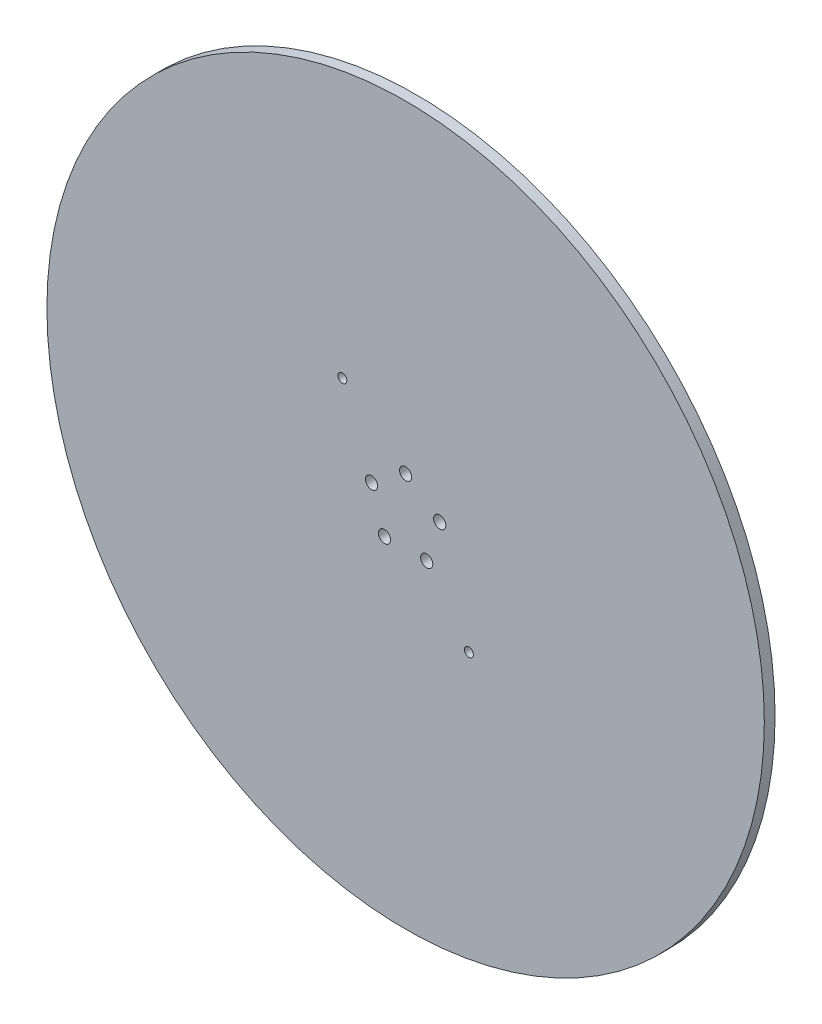
ISO-10303-21;
HEADER;
FILE_DESCRIPTION(('STEP AP214'),'2;1');
FILE_NAME('part.step','',(''),(''),'','','');
FILE_SCHEMA(('AUTOMOTIVE_DESIGN { 1 0 10303 214 1 1 1 1 }'));
ENDSEC;
DATA;
#1=APPLICATION_CONTEXT('core data for automotive mechanical design processes');
#2=APPLICATION_PROTOCOL_DEFINITION('international standard','automotive_design',2000,#1);
#3=PRODUCT_CONTEXT('',#1,'mechanical');
#4=PRODUCT('Part','Part','',(#3));
#5=PRODUCT_RELATED_PRODUCT_CATEGORY('part','',(#4));
#6=PRODUCT_DEFINITION_FORMATION('','',#4);
#7=PRODUCT_DEFINITION_CONTEXT('part definition',#1,'design');
#8=PRODUCT_DEFINITION('design','',#6,#7);
#9=PRODUCT_DEFINITION_SHAPE('','',#8);
#10=(LENGTH_UNIT() NAMED_UNIT(*) SI_UNIT(.MILLI.,.METRE.));
#11=(NAMED_UNIT(*) PLANE_ANGLE_UNIT() SI_UNIT($,.RADIAN.));
#12=(NAMED_UNIT(*) SI_UNIT($,.STERADIAN.) SOLID_ANGLE_UNIT());
#13=UNCERTAINTY_MEASURE_WITH_UNIT(LENGTH_MEASURE(1.E-05),#10,'distance_accuracy_value','');
#14=(GEOMETRIC_REPRESENTATION_CONTEXT(3) GLOBAL_UNCERTAINTY_ASSIGNED_CONTEXT((#13)) GLOBAL_UNIT_ASSIGNED_CONTEXT((#10,
#11,#12)) REPRESENTATION_CONTEXT('',''));
#15=CARTESIAN_POINT('',(0.,0.,0.));
#16=DIRECTION('',(0.,0.,1.));
#17=DIRECTION('',(1.,0.,0.));
#18=AXIS2_PLACEMENT_3D('',#15,#16,#17);
#19=CARTESIAN_POINT('',(0.,0.,3.));
#20=DIRECTION('',(0.,0.,-1.));
#21=DIRECTION('',(-1.,0.,0.));
#22=AXIS2_PLACEMENT_3D('',#19,#20,#21);
#23=CYLINDRICAL_SURFACE('',#22,100.);
#24=CARTESIAN_POINT('',(0.,0.,3.));
#25=DIRECTION('',(0.,0.,1.));
#26=DIRECTION('',(1.,0.,0.));
#27=AXIS2_PLACEMENT_3D('',#24,#25,#26);
#28=CIRCLE('',#27,100.);
#29=CARTESIAN_POINT('',(100.,0.,3.));
#30=VERTEX_POINT('',#29);
#31=EDGE_CURVE('E10',#30,#30,#28,.T.);
#32=ORIENTED_EDGE('',*,*,#31,.F.);
#33=EDGE_LOOP('',(#32));
#34=FACE_BOUND('',#33,.T.);
#35=CARTESIAN_POINT('',(0.,0.,0.));
#36=DIRECTION('',(0.,0.,1.));
#37=DIRECTION('',(1.,0.,0.));
#38=AXIS2_PLACEMENT_3D('',#35,#36,#37);
#39=CIRCLE('',#38,100.);
#40=CARTESIAN_POINT('',(100.,0.,0.));
#41=VERTEX_POINT('',#40);
#42=EDGE_CURVE('E48',#41,#41,#39,.T.);
#43=ORIENTED_EDGE('',*,*,#42,.T.);
#44=EDGE_LOOP('',(#43));
#45=FACE_BOUND('',#44,.T.);
#46=ADVANCED_FACE('F45',(#34,#45),#23,.T.);
#47=CARTESIAN_POINT('',(0.,0.,3.));
#48=DIRECTION('',(0.,0.,1.));
#49=DIRECTION('',(1.,0.,0.));
#50=AXIS2_PLACEMENT_3D('',#47,#48,#49);
#51=PLANE('',#50);
#52=CARTESIAN_POINT('',(17.6335575687742,-24.2705098312484,3.));
#53=DIRECTION('',(0.,0.,1.));
#54=DIRECTION('',(1.,0.,0.));
#55=AXIS2_PLACEMENT_3D('',#52,#53,#54);
#56=CIRCLE('',#55,1.25);
#57=CARTESIAN_POINT('',(18.8835575687742,-24.2705098312484,3.));
#58=VERTEX_POINT('',#57);
#59=EDGE_CURVE('E90',#58,#58,#56,.T.);
#60=ORIENTED_EDGE('',*,*,#59,.F.);
#61=EDGE_LOOP('',(#60));
#62=FACE_BOUND('',#61,.T.);
#63=CARTESIAN_POINT('',(-17.6335575687742,24.2705098312484,3.));
#64=DIRECTION('',(0.,0.,1.));
#65=DIRECTION('',(1.,0.,0.));
#66=AXIS2_PLACEMENT_3D('',#63,#64,#65);
#67=CIRCLE('',#66,1.25);
#68=CARTESIAN_POINT('',(-16.3835575687742,24.2705098312484,3.));
#69=VERTEX_POINT('',#68);
#70=EDGE_CURVE('E87',#69,#69,#67,.T.);
#71=ORIENTED_EDGE('',*,*,#70,.F.);
#72=EDGE_LOOP('',(#71));
#73=FACE_BOUND('',#72,.T.);
#74=CARTESIAN_POINT('',(0.,10.,3.));
#75=DIRECTION('',(0.,0.,1.));
#76=DIRECTION('',(1.,0.,0.));
#77=AXIS2_PLACEMENT_3D('',#74,#75,#76);
#78=CIRCLE('',#77,1.7);
#79=CARTESIAN_POINT('',(1.69999999999999,10.,3.));
#80=VERTEX_POINT('',#79);
#81=EDGE_CURVE('E83',#80,#80,#78,.T.);
#82=ORIENTED_EDGE('',*,*,#81,.F.);
#83=EDGE_LOOP('',(#82));
#84=FACE_BOUND('',#83,.T.);
#85=CARTESIAN_POINT('',(-9.51056516295155,3.09016994374946,3.));
#86=DIRECTION('',(0.,0.,1.));
#87=DIRECTION('',(1.,0.,0.));
#88=AXIS2_PLACEMENT_3D('',#85,#86,#87);
#89=CIRCLE('',#88,1.7);
#90=CARTESIAN_POINT('',(-7.81056516295155,3.09016994374946,3.));
#91=VERTEX_POINT('',#90);
#92=EDGE_CURVE('E77',#91,#91,#89,.T.);
#93=ORIENTED_EDGE('',*,*,#92,.F.);
#94=EDGE_LOOP('',(#93));
#95=FACE_BOUND('',#94,.T.);
#96=CARTESIAN_POINT('',(-5.87785252292472,-8.09016994374949,3.));
#97=DIRECTION('',(0.,0.,1.));
#98=DIRECTION('',(1.,0.,0.));
#99=AXIS2_PLACEMENT_3D('',#96,#97,#98);
#100=CIRCLE('',#99,1.7);
#101=CARTESIAN_POINT('',(-4.17785252292472,-8.09016994374949,3.));
#102=VERTEX_POINT('',#101);
#103=EDGE_CURVE('E71',#102,#102,#100,.T.);
#104=ORIENTED_EDGE('',*,*,#103,.F.);
#105=EDGE_LOOP('',(#104));
#106=FACE_BOUND('',#105,.T.);
#107=CARTESIAN_POINT('',(5.87785252292474,-8.09016994374947,3.));
#108=DIRECTION('',(0.,0.,1.));
#109=DIRECTION('',(1.,0.,0.));
#110=AXIS2_PLACEMENT_3D('',#107,#108,#109);
#111=CIRCLE('',#110,1.7);
#112=CARTESIAN_POINT('',(7.57785252292474,-8.09016994374947,3.));
#113=VERTEX_POINT('',#112);
#114=EDGE_CURVE('E65',#113,#113,#111,.T.);
#115=ORIENTED_EDGE('',*,*,#114,.F.);
#116=EDGE_LOOP('',(#115));
#117=FACE_BOUND('',#116,.T.);
#118=CARTESIAN_POINT('',(9.51056516295153,3.09016994374949,3.));
#119=DIRECTION('',(0.,0.,1.));
#120=DIRECTION('',(1.,0.,0.));
#121=AXIS2_PLACEMENT_3D('',#118,#119,#120);
#122=CIRCLE('',#121,1.7);
#123=CARTESIAN_POINT('',(11.2105651629515,3.09016994374949,3.));
#124=VERTEX_POINT('',#123);
#125=EDGE_CURVE('E59',#124,#124,#122,.T.);
#126=ORIENTED_EDGE('',*,*,#125,.F.);
#127=EDGE_LOOP('',(#126));
#128=FACE_BOUND('',#127,.T.);
#129=ORIENTED_EDGE('',*,*,#31,.T.);
#130=EDGE_LOOP('',(#129));
#131=FACE_BOUND('',#130,.T.);
#132=ADVANCED_FACE('F102',(#62,#73,#84,#95,#106,#117,#128,#131),#51,.T.);
#133=CARTESIAN_POINT('',(0.,0.,0.));
#134=DIRECTION('',(0.,0.,1.));
#135=DIRECTION('',(1.,0.,0.));
#136=AXIS2_PLACEMENT_3D('',#133,#134,#135);
#137=PLANE('',#136);
#138=CARTESIAN_POINT('',(17.6335575687742,-24.2705098312484,0.));
#139=DIRECTION('',(0.,0.,1.));
#140=DIRECTION('',(1.,0.,0.));
#141=AXIS2_PLACEMENT_3D('',#138,#139,#140);
#142=CIRCLE('',#141,1.25);
#143=CARTESIAN_POINT('',(18.8835575687742,-24.2705098312484,0.));
#144=VERTEX_POINT('',#143);
#145=EDGE_CURVE('E86',#144,#144,#142,.F.);
#146=ORIENTED_EDGE('',*,*,#145,.F.);
#147=EDGE_LOOP('',(#146));
#148=FACE_BOUND('',#147,.T.);
#149=CARTESIAN_POINT('',(-17.6335575687742,24.2705098312484,0.));
#150=DIRECTION('',(0.,0.,1.));
#151=DIRECTION('',(1.,0.,0.));
#152=AXIS2_PLACEMENT_3D('',#149,#150,#151);
#153=CIRCLE('',#152,1.25);
#154=CARTESIAN_POINT('',(-16.3835575687742,24.2705098312484,0.));
#155=VERTEX_POINT('',#154);
#156=EDGE_CURVE('E91',#155,#155,#153,.F.);
#157=ORIENTED_EDGE('',*,*,#156,.F.);
#158=EDGE_LOOP('',(#157));
#159=FACE_BOUND('',#158,.T.);
#160=CARTESIAN_POINT('',(0.,10.,0.));
#161=DIRECTION('',(0.,0.,1.));
#162=DIRECTION('',(1.,0.,0.));
#163=AXIS2_PLACEMENT_3D('',#160,#161,#162);
#164=CIRCLE('',#163,1.7);
#165=CARTESIAN_POINT('',(1.69999999999999,10.,0.));
#166=VERTEX_POINT('',#165);
#167=EDGE_CURVE('E80',#166,#166,#164,.T.);
#168=ORIENTED_EDGE('',*,*,#167,.T.);
#169=EDGE_LOOP('',(#168));
#170=FACE_BOUND('',#169,.T.);
#171=CARTESIAN_POINT('',(-9.51056516295155,3.09016994374946,0.));
#172=DIRECTION('',(0.,0.,1.));
#173=DIRECTION('',(1.,0.,0.));
#174=AXIS2_PLACEMENT_3D('',#171,#172,#173);
#175=CIRCLE('',#174,1.7);
#176=CARTESIAN_POINT('',(-7.81056516295155,3.09016994374946,0.));
#177=VERTEX_POINT('',#176);
#178=EDGE_CURVE('E74',#177,#177,#175,.T.);
#179=ORIENTED_EDGE('',*,*,#178,.T.);
#180=EDGE_LOOP('',(#179));
#181=FACE_BOUND('',#180,.T.);
#182=CARTESIAN_POINT('',(-5.87785252292472,-8.09016994374949,0.));
#183=DIRECTION('',(0.,0.,1.));
#184=DIRECTION('',(1.,0.,0.));
#185=AXIS2_PLACEMENT_3D('',#182,#183,#184);
#186=CIRCLE('',#185,1.7);
#187=CARTESIAN_POINT('',(-4.17785252292472,-8.09016994374949,0.));
#188=VERTEX_POINT('',#187);
#189=EDGE_CURVE('E68',#188,#188,#186,.T.);
#190=ORIENTED_EDGE('',*,*,#189,.T.);
#191=EDGE_LOOP('',(#190));
#192=FACE_BOUND('',#191,.T.);
#193=CARTESIAN_POINT('',(5.87785252292474,-8.09016994374947,0.));
#194=DIRECTION('',(0.,0.,1.));
#195=DIRECTION('',(1.,0.,0.));
#196=AXIS2_PLACEMENT_3D('',#193,#194,#195);
#197=CIRCLE('',#196,1.7);
#198=CARTESIAN_POINT('',(7.57785252292474,-8.09016994374947,0.));
#199=VERTEX_POINT('',#198);
#200=EDGE_CURVE('E62',#199,#199,#197,.T.);
#201=ORIENTED_EDGE('',*,*,#200,.T.);
#202=EDGE_LOOP('',(#201));
#203=FACE_BOUND('',#202,.T.);
#204=CARTESIAN_POINT('',(9.51056516295153,3.09016994374949,0.));
#205=DIRECTION('',(0.,0.,1.));
#206=DIRECTION('',(1.,0.,0.));
#207=AXIS2_PLACEMENT_3D('',#204,#205,#206);
#208=CIRCLE('',#207,1.7);
#209=CARTESIAN_POINT('',(11.2105651629515,3.09016994374949,0.));
#210=VERTEX_POINT('',#209);
#211=EDGE_CURVE('E55',#210,#210,#208,.T.);
#212=ORIENTED_EDGE('',*,*,#211,.T.);
#213=EDGE_LOOP('',(#212));
#214=FACE_BOUND('',#213,.T.);
#215=ORIENTED_EDGE('',*,*,#42,.F.);
#216=EDGE_LOOP('',(#215));
#217=FACE_BOUND('',#216,.T.);
#218=ADVANCED_FACE('F105',(#148,#159,#170,#181,#192,#203,#214,#217),#137,.F.);
#219=CARTESIAN_POINT('',(9.51056516295153,3.09016994374949,3.));
#220=DIRECTION('',(0.,0.,1.));
#221=DIRECTION('',(1.,0.,0.));
#222=AXIS2_PLACEMENT_3D('',#219,#220,#221);
#223=CYLINDRICAL_SURFACE('',#222,1.7);
#224=ORIENTED_EDGE('',*,*,#211,.F.);
#225=EDGE_LOOP('',(#224));
#226=FACE_BOUND('',#225,.T.);
#227=ORIENTED_EDGE('',*,*,#125,.T.);
#228=EDGE_LOOP('',(#227));
#229=FACE_BOUND('',#228,.T.);
#230=ADVANCED_FACE('F119',(#226,#229),#223,.F.);
#231=CARTESIAN_POINT('',(5.87785252292474,-8.09016994374947,3.));
#232=DIRECTION('',(0.,0.,1.));
#233=DIRECTION('',(1.,0.,0.));
#234=AXIS2_PLACEMENT_3D('',#231,#232,#233);
#235=CYLINDRICAL_SURFACE('',#234,1.7);
#236=ORIENTED_EDGE('',*,*,#200,.F.);
#237=EDGE_LOOP('',(#236));
#238=FACE_BOUND('',#237,.T.);
#239=ORIENTED_EDGE('',*,*,#114,.T.);
#240=EDGE_LOOP('',(#239));
#241=FACE_BOUND('',#240,.T.);
#242=ADVANCED_FACE('F121',(#238,#241),#235,.F.);
#243=CARTESIAN_POINT('',(-5.87785252292472,-8.09016994374949,3.));
#244=DIRECTION('',(0.,0.,1.));
#245=DIRECTION('',(1.,0.,0.));
#246=AXIS2_PLACEMENT_3D('',#243,#244,#245);
#247=CYLINDRICAL_SURFACE('',#246,1.7);
#248=ORIENTED_EDGE('',*,*,#189,.F.);
#249=EDGE_LOOP('',(#248));
#250=FACE_BOUND('',#249,.T.);
#251=ORIENTED_EDGE('',*,*,#103,.T.);
#252=EDGE_LOOP('',(#251));
#253=FACE_BOUND('',#252,.T.);
#254=ADVANCED_FACE('F128',(#250,#253),#247,.F.);
#255=CARTESIAN_POINT('',(-9.51056516295155,3.09016994374946,3.));
#256=DIRECTION('',(0.,0.,1.));
#257=DIRECTION('',(1.,0.,0.));
#258=AXIS2_PLACEMENT_3D('',#255,#256,#257);
#259=CYLINDRICAL_SURFACE('',#258,1.7);
#260=ORIENTED_EDGE('',*,*,#178,.F.);
#261=EDGE_LOOP('',(#260));
#262=FACE_BOUND('',#261,.T.);
#263=ORIENTED_EDGE('',*,*,#92,.T.);
#264=EDGE_LOOP('',(#263));
#265=FACE_BOUND('',#264,.T.);
#266=ADVANCED_FACE('F168',(#262,#265),#259,.F.);
#267=CARTESIAN_POINT('',(0.,10.,3.));
#268=DIRECTION('',(0.,0.,1.));
#269=DIRECTION('',(1.,0.,0.));
#270=AXIS2_PLACEMENT_3D('',#267,#268,#269);
#271=CYLINDRICAL_SURFACE('',#270,1.7);
#272=ORIENTED_EDGE('',*,*,#167,.F.);
#273=EDGE_LOOP('',(#272));
#274=FACE_BOUND('',#273,.T.);
#275=ORIENTED_EDGE('',*,*,#81,.T.);
#276=EDGE_LOOP('',(#275));
#277=FACE_BOUND('',#276,.T.);
#278=ADVANCED_FACE('F178',(#274,#277),#271,.F.);
#279=CARTESIAN_POINT('',(-17.6335575687742,24.2705098312484,-0.00100000000000013));
#280=DIRECTION('',(0.,0.,1.));
#281=DIRECTION('',(1.,0.,0.));
#282=AXIS2_PLACEMENT_3D('',#279,#280,#281);
#283=CYLINDRICAL_SURFACE('',#282,1.25);
#284=CARTESIAN_POINT('',(-16.3835575687742,24.2705098312484,3.));
#285=CARTESIAN_POINT('',(-16.3835575687742,24.2705098312484,2.96875));
#286=CARTESIAN_POINT('',(-16.3835575687742,24.2705098312484,2.9375));
#287=CARTESIAN_POINT('',(-16.3835575687742,24.2705098312484,2.875));
#288=CARTESIAN_POINT('',(-16.3835575687742,24.2705098312484,2.84375));
#289=CARTESIAN_POINT('',(-16.3835575687742,24.2705098312484,2.78125));
#290=CARTESIAN_POINT('',(-16.3835575687742,24.2705098312484,2.75));
#291=CARTESIAN_POINT('',(-16.3835575687742,24.2705098312484,2.6875));
#292=CARTESIAN_POINT('',(-16.3835575687742,24.2705098312484,2.65625));
#293=CARTESIAN_POINT('',(-16.3835575687742,24.2705098312484,2.59375));
#294=CARTESIAN_POINT('',(-16.3835575687742,24.2705098312484,2.5625));
#295=CARTESIAN_POINT('',(-16.3835575687742,24.2705098312484,2.5));
#296=CARTESIAN_POINT('',(-16.3835575687742,24.2705098312484,2.46875));
#297=CARTESIAN_POINT('',(-16.3835575687742,24.2705098312484,2.40625));
#298=CARTESIAN_POINT('',(-16.3835575687742,24.2705098312484,2.375));
#299=CARTESIAN_POINT('',(-16.3835575687742,24.2705098312484,2.3125));
#300=CARTESIAN_POINT('',(-16.3835575687742,24.2705098312484,2.28125));
#301=CARTESIAN_POINT('',(-16.3835575687742,24.2705098312484,2.21875));
#302=CARTESIAN_POINT('',(-16.3835575687742,24.2705098312484,2.1875));
#303=CARTESIAN_POINT('',(-16.3835575687742,24.2705098312484,2.125));
#304=CARTESIAN_POINT('',(-16.3835575687742,24.2705098312484,2.09375));
#305=CARTESIAN_POINT('',(-16.3835575687742,24.2705098312484,2.03125));
#306=CARTESIAN_POINT('',(-16.3835575687742,24.2705098312484,2.));
#307=CARTESIAN_POINT('',(-16.3835575687742,24.2705098312484,1.9375));
#308=CARTESIAN_POINT('',(-16.3835575687742,24.2705098312484,1.90625));
#309=CARTESIAN_POINT('',(-16.3835575687742,24.2705098312484,1.84375));
#310=CARTESIAN_POINT('',(-16.3835575687742,24.2705098312484,1.8125));
#311=CARTESIAN_POINT('',(-16.3835575687742,24.2705098312484,1.75));
#312=CARTESIAN_POINT('',(-16.3835575687742,24.2705098312484,1.71875));
#313=CARTESIAN_POINT('',(-16.3835575687742,24.2705098312484,1.65625));
#314=CARTESIAN_POINT('',(-16.3835575687742,24.2705098312484,1.625));
#315=CARTESIAN_POINT('',(-16.3835575687742,24.2705098312484,1.5625));
#316=CARTESIAN_POINT('',(-16.3835575687742,24.2705098312484,1.53125));
#317=CARTESIAN_POINT('',(-16.3835575687742,24.2705098312484,1.46875));
#318=CARTESIAN_POINT('',(-16.3835575687742,24.2705098312484,1.4375));
#319=CARTESIAN_POINT('',(-16.3835575687742,24.2705098312484,1.375));
#320=CARTESIAN_POINT('',(-16.3835575687742,24.2705098312484,1.34375));
#321=CARTESIAN_POINT('',(-16.3835575687742,24.2705098312484,1.28125));
#322=CARTESIAN_POINT('',(-16.3835575687742,24.2705098312484,1.25));
#323=CARTESIAN_POINT('',(-16.3835575687742,24.2705098312484,1.1875));
#324=CARTESIAN_POINT('',(-16.3835575687742,24.2705098312484,1.15625));
#325=CARTESIAN_POINT('',(-16.3835575687742,24.2705098312484,1.09375));
#326=CARTESIAN_POINT('',(-16.3835575687742,24.2705098312484,1.0625));
#327=CARTESIAN_POINT('',(-16.3835575687742,24.2705098312484,1.));
#328=CARTESIAN_POINT('',(-16.3835575687742,24.2705098312484,0.96875));
#329=CARTESIAN_POINT('',(-16.3835575687742,24.2705098312484,0.90625));
#330=CARTESIAN_POINT('',(-16.3835575687742,24.2705098312484,0.875));
#331=CARTESIAN_POINT('',(-16.3835575687742,24.2705098312484,0.8125));
#332=CARTESIAN_POINT('',(-16.3835575687742,24.2705098312484,0.78125));
#333=CARTESIAN_POINT('',(-16.3835575687742,24.2705098312484,0.71875));
#334=CARTESIAN_POINT('',(-16.3835575687742,24.2705098312484,0.6875));
#335=CARTESIAN_POINT('',(-16.3835575687742,24.2705098312484,0.625));
#336=CARTESIAN_POINT('',(-16.3835575687742,24.2705098312484,0.59375));
#337=CARTESIAN_POINT('',(-16.3835575687742,24.2705098312484,0.53125));
#338=CARTESIAN_POINT('',(-16.3835575687742,24.2705098312484,0.5));
#339=CARTESIAN_POINT('',(-16.3835575687742,24.2705098312484,0.4375));
#340=CARTESIAN_POINT('',(-16.3835575687742,24.2705098312484,0.40625));
#341=CARTESIAN_POINT('',(-16.3835575687742,24.2705098312484,0.34375));
#342=CARTESIAN_POINT('',(-16.3835575687742,24.2705098312484,0.3125));
#343=CARTESIAN_POINT('',(-16.3835575687742,24.2705098312484,0.25));
#344=CARTESIAN_POINT('',(-16.3835575687742,24.2705098312484,0.21875));
#345=CARTESIAN_POINT('',(-16.3835575687742,24.2705098312484,0.15625));
#346=CARTESIAN_POINT('',(-16.3835575687742,24.2705098312484,0.125));
#347=CARTESIAN_POINT('',(-16.3835575687742,24.2705098312484,0.0625000000000001));
#348=CARTESIAN_POINT('',(-16.3835575687742,24.2705098312484,0.0312500000000001));
#349=CARTESIAN_POINT('',(-16.3835575687742,24.2705098312484,0.));
#350=B_SPLINE_CURVE_WITH_KNOTS('',3,(#284,#285,#286,#287,#288,#289,#290,#291,#292,#293,#294,
#295,#296,#297,#298,#299,#300,#301,#302,#303,#304,#305,#306,#307,#308,#309,#310,#311,#312,#313,
#314,#315,#316,#317,#318,#319,#320,#321,#322,#323,#324,#325,#326,#327,#328,#329,#330,#331,#332,
#333,#334,#335,#336,#337,#338,#339,#340,#341,#342,#343,#344,#345,#346,#347,#348,#349),
.UNSPECIFIED.,.F.,.F.,(4,2,2,2,2,2,2,2,2,2,2,2,2,2,2,2,2,2,2,2,2,2,2,2,2,2,2,2,2,2,2,2,4),(0.,
0.0937500000000001,0.1875,0.28125,0.375,0.46875,0.5625,0.65625,0.75,0.84375,0.9375,1.03125,
1.125,1.21875,1.3125,1.40625,1.5,1.59375,1.6875,1.78125,1.875,1.96875,2.0625,2.15625,2.25,
2.34375,2.4375,2.53125,2.625,2.71875,2.8125,2.90625,3.),.UNSPECIFIED.);
#351=EDGE_CURVE('BSEAM188',#69,#155,#350,.T.);
#352=ORIENTED_EDGE('',*,*,#70,.T.);
#353=ORIENTED_EDGE('',*,*,#156,.T.);
#354=ORIENTED_EDGE('',*,*,#351,.T.);
#355=ORIENTED_EDGE('',*,*,#351,.F.);
#356=EDGE_LOOP('',(#352,#354,#353,#355));
#357=FACE_BOUND('',#356,.T.);
#358=ADVANCED_FACE('F188',(#357),#283,.F.);
#359=CARTESIAN_POINT('',(17.6335575687742,-24.2705098312484,-0.00100000000000013));
#360=DIRECTION('',(0.,0.,1.));
#361=DIRECTION('',(1.,0.,0.));
#362=AXIS2_PLACEMENT_3D('',#359,#360,#361);
#363=CYLINDRICAL_SURFACE('',#362,1.25);
#364=CARTESIAN_POINT('',(18.8835575687742,-24.2705098312484,3.));
#365=CARTESIAN_POINT('',(18.8835575687742,-24.2705098312484,2.96875));
#366=CARTESIAN_POINT('',(18.8835575687742,-24.2705098312484,2.9375));
#367=CARTESIAN_POINT('',(18.8835575687742,-24.2705098312484,2.875));
#368=CARTESIAN_POINT('',(18.8835575687742,-24.2705098312484,2.84375));
#369=CARTESIAN_POINT('',(18.8835575687742,-24.2705098312484,2.78125));
#370=CARTESIAN_POINT('',(18.8835575687742,-24.2705098312484,2.75));
#371=CARTESIAN_POINT('',(18.8835575687742,-24.2705098312484,2.6875));
#372=CARTESIAN_POINT('',(18.8835575687742,-24.2705098312484,2.65625));
#373=CARTESIAN_POINT('',(18.8835575687742,-24.2705098312484,2.59375));
#374=CARTESIAN_POINT('',(18.8835575687742,-24.2705098312484,2.5625));
#375=CARTESIAN_POINT('',(18.8835575687742,-24.2705098312484,2.5));
#376=CARTESIAN_POINT('',(18.8835575687742,-24.2705098312484,2.46875));
#377=CARTESIAN_POINT('',(18.8835575687742,-24.2705098312484,2.40625));
#378=CARTESIAN_POINT('',(18.8835575687742,-24.2705098312484,2.375));
#379=CARTESIAN_POINT('',(18.8835575687742,-24.2705098312484,2.3125));
#380=CARTESIAN_POINT('',(18.8835575687742,-24.2705098312484,2.28125));
#381=CARTESIAN_POINT('',(18.8835575687742,-24.2705098312484,2.21875));
#382=CARTESIAN_POINT('',(18.8835575687742,-24.2705098312484,2.1875));
#383=CARTESIAN_POINT('',(18.8835575687742,-24.2705098312484,2.125));
#384=CARTESIAN_POINT('',(18.8835575687742,-24.2705098312484,2.09375));
#385=CARTESIAN_POINT('',(18.8835575687742,-24.2705098312484,2.03125));
#386=CARTESIAN_POINT('',(18.8835575687742,-24.2705098312484,2.));
#387=CARTESIAN_POINT('',(18.8835575687742,-24.2705098312484,1.9375));
#388=CARTESIAN_POINT('',(18.8835575687742,-24.2705098312484,1.90625));
#389=CARTESIAN_POINT('',(18.8835575687742,-24.2705098312484,1.84375));
#390=CARTESIAN_POINT('',(18.8835575687742,-24.2705098312484,1.8125));
#391=CARTESIAN_POINT('',(18.8835575687742,-24.2705098312484,1.75));
#392=CARTESIAN_POINT('',(18.8835575687742,-24.2705098312484,1.71875));
#393=CARTESIAN_POINT('',(18.8835575687742,-24.2705098312484,1.65625));
#394=CARTESIAN_POINT('',(18.8835575687742,-24.2705098312484,1.625));
#395=CARTESIAN_POINT('',(18.8835575687742,-24.2705098312484,1.5625));
#396=CARTESIAN_POINT('',(18.8835575687742,-24.2705098312484,1.53125));
#397=CARTESIAN_POINT('',(18.8835575687742,-24.2705098312484,1.46875));
#398=CARTESIAN_POINT('',(18.8835575687742,-24.2705098312484,1.4375));
#399=CARTESIAN_POINT('',(18.8835575687742,-24.2705098312484,1.375));
#400=CARTESIAN_POINT('',(18.8835575687742,-24.2705098312484,1.34375));
#401=CARTESIAN_POINT('',(18.8835575687742,-24.2705098312484,1.28125));
#402=CARTESIAN_POINT('',(18.8835575687742,-24.2705098312484,1.25));
#403=CARTESIAN_POINT('',(18.8835575687742,-24.2705098312484,1.1875));
#404=CARTESIAN_POINT('',(18.8835575687742,-24.2705098312484,1.15625));
#405=CARTESIAN_POINT('',(18.8835575687742,-24.2705098312484,1.09375));
#406=CARTESIAN_POINT('',(18.8835575687742,-24.2705098312484,1.0625));
#407=CARTESIAN_POINT('',(18.8835575687742,-24.2705098312484,1.));
#408=CARTESIAN_POINT('',(18.8835575687742,-24.2705098312484,0.96875));
#409=CARTESIAN_POINT('',(18.8835575687742,-24.2705098312484,0.90625));
#410=CARTESIAN_POINT('',(18.8835575687742,-24.2705098312484,0.875));
#411=CARTESIAN_POINT('',(18.8835575687742,-24.2705098312484,0.8125));
#412=CARTESIAN_POINT('',(18.8835575687742,-24.2705098312484,0.78125));
#413=CARTESIAN_POINT('',(18.8835575687742,-24.2705098312484,0.71875));
#414=CARTESIAN_POINT('',(18.8835575687742,-24.2705098312484,0.6875));
#415=CARTESIAN_POINT('',(18.8835575687742,-24.2705098312484,0.625));
#416=CARTESIAN_POINT('',(18.8835575687742,-24.2705098312484,0.59375));
#417=CARTESIAN_POINT('',(18.8835575687742,-24.2705098312484,0.53125));
#418=CARTESIAN_POINT('',(18.8835575687742,-24.2705098312484,0.5));
#419=CARTESIAN_POINT('',(18.8835575687742,-24.2705098312484,0.4375));
#420=CARTESIAN_POINT('',(18.8835575687742,-24.2705098312484,0.40625));
#421=CARTESIAN_POINT('',(18.8835575687742,-24.2705098312484,0.34375));
#422=CARTESIAN_POINT('',(18.8835575687742,-24.2705098312484,0.3125));
#423=CARTESIAN_POINT('',(18.8835575687742,-24.2705098312484,0.25));
#424=CARTESIAN_POINT('',(18.8835575687742,-24.2705098312484,0.21875));
#425=CARTESIAN_POINT('',(18.8835575687742,-24.2705098312484,0.15625));
#426=CARTESIAN_POINT('',(18.8835575687742,-24.2705098312484,0.125));
#427=CARTESIAN_POINT('',(18.8835575687742,-24.2705098312484,0.0625000000000001));
#428=CARTESIAN_POINT('',(18.8835575687742,-24.2705098312484,0.0312500000000001));
#429=CARTESIAN_POINT('',(18.8835575687742,-24.2705098312484,0.));
#430=B_SPLINE_CURVE_WITH_KNOTS('',3,(#364,#365,#366,#367,#368,#369,#370,#371,#372,#373,#374,
#375,#376,#377,#378,#379,#380,#381,#382,#383,#384,#385,#386,#387,#388,#389,#390,#391,#392,#393,
#394,#395,#396,#397,#398,#399,#400,#401,#402,#403,#404,#405,#406,#407,#408,#409,#410,#411,#412,
#413,#414,#415,#416,#417,#418,#419,#420,#421,#422,#423,#424,#425,#426,#427,#428,#429),
.UNSPECIFIED.,.F.,.F.,(4,2,2,2,2,2,2,2,2,2,2,2,2,2,2,2,2,2,2,2,2,2,2,2,2,2,2,2,2,2,2,2,4),(0.,
0.0937500000000001,0.1875,0.28125,0.375,0.46875,0.5625,0.65625,0.75,0.84375,0.9375,1.03125,
1.125,1.21875,1.3125,1.40625,1.5,1.59375,1.6875,1.78125,1.875,1.96875,2.0625,2.15625,2.25,
2.34375,2.4375,2.53125,2.625,2.71875,2.8125,2.90625,3.),.UNSPECIFIED.);
#431=EDGE_CURVE('BSEAM99',#58,#144,#430,.T.);
#432=ORIENTED_EDGE('',*,*,#59,.T.);
#433=ORIENTED_EDGE('',*,*,#145,.T.);
#434=ORIENTED_EDGE('',*,*,#431,.T.);
#435=ORIENTED_EDGE('',*,*,#431,.F.);
#436=EDGE_LOOP('',(#432,#434,#433,#435));
#437=FACE_BOUND('',#436,.T.);
#438=ADVANCED_FACE('F99',(#437),#363,.F.);
#439=CLOSED_SHELL('',(#46,#132,#218,#230,#242,#254,#266,#278,#358,#438));
#440=MANIFOLD_SOLID_BREP('B2',#439);
#441=ADVANCED_BREP_SHAPE_REPRESENTATION('',(#18,#440),#14);
#442=SHAPE_DEFINITION_REPRESENTATION(#9,#441);
ENDSEC;
END-ISO-10303-21;
